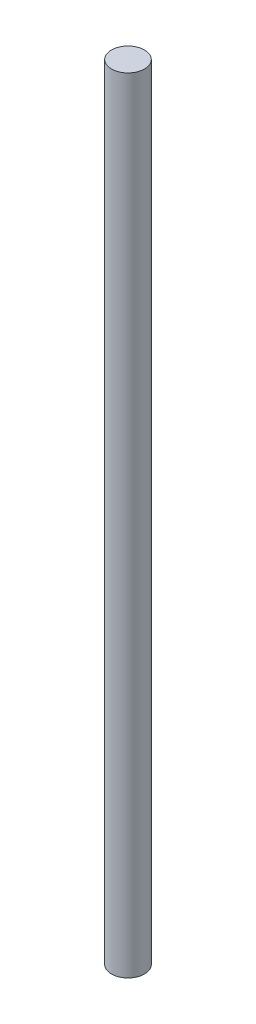
ISO-10303-21;
HEADER;
FILE_DESCRIPTION(('STEP AP214'),'2;1');
FILE_NAME('part.step','',(''),(''),'','','');
FILE_SCHEMA(('AUTOMOTIVE_DESIGN { 1 0 10303 214 1 1 1 1 }'));
ENDSEC;
DATA;
#1=APPLICATION_CONTEXT('core data for automotive mechanical design processes');
#2=APPLICATION_PROTOCOL_DEFINITION('international standard','automotive_design',2000,#1);
#3=PRODUCT_CONTEXT('',#1,'mechanical');
#4=PRODUCT('Part','Part','',(#3));
#5=PRODUCT_RELATED_PRODUCT_CATEGORY('part','',(#4));
#6=PRODUCT_DEFINITION_FORMATION('','',#4);
#7=PRODUCT_DEFINITION_CONTEXT('part definition',#1,'design');
#8=PRODUCT_DEFINITION('design','',#6,#7);
#9=PRODUCT_DEFINITION_SHAPE('','',#8);
#10=(LENGTH_UNIT() NAMED_UNIT(*) SI_UNIT(.MILLI.,.METRE.));
#11=(NAMED_UNIT(*) PLANE_ANGLE_UNIT() SI_UNIT($,.RADIAN.));
#12=(NAMED_UNIT(*) SI_UNIT($,.STERADIAN.) SOLID_ANGLE_UNIT());
#13=UNCERTAINTY_MEASURE_WITH_UNIT(LENGTH_MEASURE(1.E-05),#10,'distance_accuracy_value','');
#14=(GEOMETRIC_REPRESENTATION_CONTEXT(3) GLOBAL_UNCERTAINTY_ASSIGNED_CONTEXT((#13)) GLOBAL_UNIT_ASSIGNED_CONTEXT((#10,
#11,#12)) REPRESENTATION_CONTEXT('',''));
#15=CARTESIAN_POINT('',(0.,0.,0.));
#16=DIRECTION('',(0.,0.,1.));
#17=DIRECTION('',(1.,0.,0.));
#18=AXIS2_PLACEMENT_3D('',#15,#16,#17);
#19=CARTESIAN_POINT('',(0.,95.,0.));
#20=DIRECTION('',(0.,-1.,0.));
#21=DIRECTION('',(0.,0.,-1.));
#22=AXIS2_PLACEMENT_3D('',#19,#20,#21);
#23=CYLINDRICAL_SURFACE('',#22,2.);
#24=CARTESIAN_POINT('',(0.,95.,0.));
#25=DIRECTION('',(0.,1.,0.));
#26=DIRECTION('',(0.,0.,1.));
#27=AXIS2_PLACEMENT_3D('',#24,#25,#26);
#28=CIRCLE('',#27,2.);
#29=CARTESIAN_POINT('',(0.,95.,2.));
#30=VERTEX_POINT('',#29);
#31=EDGE_CURVE('E10',#30,#30,#28,.T.);
#32=ORIENTED_EDGE('',*,*,#31,.F.);
#33=EDGE_LOOP('',(#32));
#34=FACE_BOUND('',#33,.T.);
#35=CARTESIAN_POINT('',(0.,0.,0.));
#36=DIRECTION('',(0.,1.,0.));
#37=DIRECTION('',(0.,0.,1.));
#38=AXIS2_PLACEMENT_3D('',#35,#36,#37);
#39=CIRCLE('',#38,2.);
#40=CARTESIAN_POINT('',(0.,0.,2.));
#41=VERTEX_POINT('',#40);
#42=EDGE_CURVE('E36',#41,#41,#39,.T.);
#43=ORIENTED_EDGE('',*,*,#42,.T.);
#44=EDGE_LOOP('',(#43));
#45=FACE_BOUND('',#44,.T.);
#46=ADVANCED_FACE('F33',(#34,#45),#23,.T.);
#47=CARTESIAN_POINT('',(0.,95.,0.));
#48=DIRECTION('',(0.,1.,0.));
#49=DIRECTION('',(0.,0.,1.));
#50=AXIS2_PLACEMENT_3D('',#47,#48,#49);
#51=PLANE('',#50);
#52=ORIENTED_EDGE('',*,*,#31,.T.);
#53=EDGE_LOOP('',(#52));
#54=FACE_BOUND('',#53,.T.);
#55=ADVANCED_FACE('F48',(#54),#51,.T.);
#56=CARTESIAN_POINT('',(0.,0.,0.));
#57=DIRECTION('',(0.,1.,0.));
#58=DIRECTION('',(0.,0.,1.));
#59=AXIS2_PLACEMENT_3D('',#56,#57,#58);
#60=PLANE('',#59);
#61=ORIENTED_EDGE('',*,*,#42,.F.);
#62=EDGE_LOOP('',(#61));
#63=FACE_BOUND('',#62,.T.);
#64=ADVANCED_FACE('F46',(#63),#60,.F.);
#65=CLOSED_SHELL('',(#46,#55,#64));
#66=MANIFOLD_SOLID_BREP('B2',#65);
#67=ADVANCED_BREP_SHAPE_REPRESENTATION('',(#18,#66),#14);
#68=SHAPE_DEFINITION_REPRESENTATION(#9,#67);
ENDSEC;
END-ISO-10303-21;
